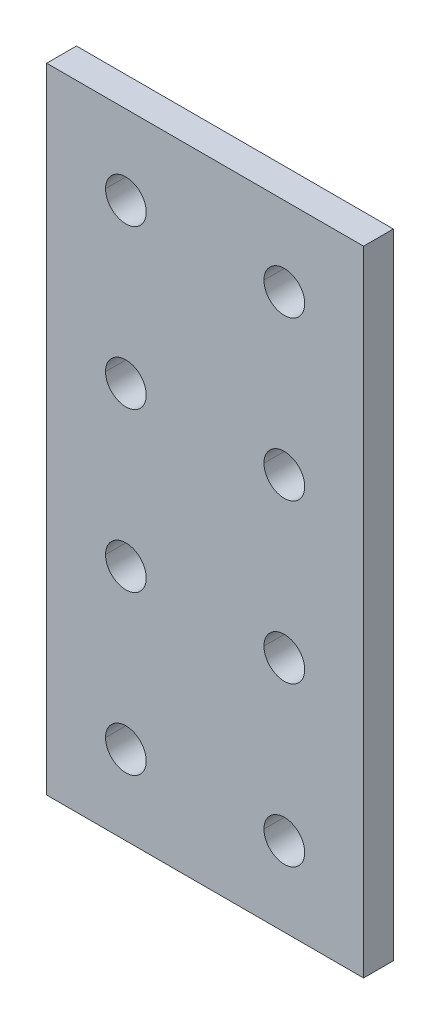
ISO-10303-21;
HEADER;
FILE_DESCRIPTION(('STEP AP214'),'2;1');
FILE_NAME('part.step','',(''),(''),'','','');
FILE_SCHEMA(('AUTOMOTIVE_DESIGN { 1 0 10303 214 1 1 1 1 }'));
ENDSEC;
DATA;
#1=APPLICATION_CONTEXT('core data for automotive mechanical design processes');
#2=APPLICATION_PROTOCOL_DEFINITION('international standard','automotive_design',2000,#1);
#3=PRODUCT_CONTEXT('',#1,'mechanical');
#4=PRODUCT('Part','Part','',(#3));
#5=PRODUCT_RELATED_PRODUCT_CATEGORY('part','',(#4));
#6=PRODUCT_DEFINITION_FORMATION('','',#4);
#7=PRODUCT_DEFINITION_CONTEXT('part definition',#1,'design');
#8=PRODUCT_DEFINITION('design','',#6,#7);
#9=PRODUCT_DEFINITION_SHAPE('','',#8);
#10=(LENGTH_UNIT() NAMED_UNIT(*) SI_UNIT(.MILLI.,.METRE.));
#11=(NAMED_UNIT(*) PLANE_ANGLE_UNIT() SI_UNIT($,.RADIAN.));
#12=(NAMED_UNIT(*) SI_UNIT($,.STERADIAN.) SOLID_ANGLE_UNIT());
#13=UNCERTAINTY_MEASURE_WITH_UNIT(LENGTH_MEASURE(1.E-05),#10,'distance_accuracy_value','');
#14=(GEOMETRIC_REPRESENTATION_CONTEXT(3) GLOBAL_UNCERTAINTY_ASSIGNED_CONTEXT((#13)) GLOBAL_UNIT_ASSIGNED_CONTEXT((#10,
#11,#12)) REPRESENTATION_CONTEXT('',''));
#15=CARTESIAN_POINT('',(0.,0.,0.));
#16=DIRECTION('',(0.,0.,1.));
#17=DIRECTION('',(1.,0.,0.));
#18=AXIS2_PLACEMENT_3D('',#15,#16,#17);
#19=CARTESIAN_POINT('',(25.4,50.8,2.3876));
#20=DIRECTION('',(0.,-1.,0.));
#21=DIRECTION('',(0.,0.,-1.));
#22=AXIS2_PLACEMENT_3D('',#19,#20,#21);
#23=PLANE('',#22);
#24=DIRECTION('',(-1.,0.,0.));
#25=VECTOR('',#24,1.);
#26=CARTESIAN_POINT('',(25.4,50.8,-2.3876));
#27=LINE('',#26,#25);
#28=CARTESIAN_POINT('',(25.4,50.8,-2.3876));
#29=VERTEX_POINT('',#28);
#30=CARTESIAN_POINT('',(-25.4,50.8,-2.3876));
#31=VERTEX_POINT('',#30);
#32=EDGE_CURVE('E9',#29,#31,#27,.T.);
#33=ORIENTED_EDGE('',*,*,#32,.T.);
#34=DIRECTION('',(0.,0.,-1.));
#35=VECTOR('',#34,1.);
#36=CARTESIAN_POINT('',(-25.4,50.8,2.3876));
#37=LINE('',#36,#35);
#38=CARTESIAN_POINT('',(-25.4,50.8,2.3876));
#39=VERTEX_POINT('',#38);
#40=EDGE_CURVE('E24',#39,#31,#37,.T.);
#41=ORIENTED_EDGE('',*,*,#40,.F.);
#42=DIRECTION('',(-1.,0.,0.));
#43=VECTOR('',#42,1.);
#44=CARTESIAN_POINT('',(25.4,50.8,2.3876));
#45=LINE('',#44,#43);
#46=CARTESIAN_POINT('',(25.4,50.8,2.3876));
#47=VERTEX_POINT('',#46);
#48=EDGE_CURVE('E451',#47,#39,#45,.T.);
#49=ORIENTED_EDGE('',*,*,#48,.F.);
#50=DIRECTION('',(0.,0.,-1.));
#51=VECTOR('',#50,1.);
#52=CARTESIAN_POINT('',(25.4,50.8,2.3876));
#53=LINE('',#52,#51);
#54=EDGE_CURVE('E446',#47,#29,#53,.T.);
#55=ORIENTED_EDGE('',*,*,#54,.T.);
#56=EDGE_LOOP('',(#33,#41,#49,#55));
#57=FACE_BOUND('',#56,.T.);
#58=ADVANCED_FACE('F15',(#57),#23,.F.);
#59=CARTESIAN_POINT('',(25.4,-50.8,2.3876));
#60=DIRECTION('',(-1.,0.,0.));
#61=DIRECTION('',(0.,0.,1.));
#62=AXIS2_PLACEMENT_3D('',#59,#60,#61);
#63=PLANE('',#62);
#64=DIRECTION('',(0.,1.,0.));
#65=VECTOR('',#64,1.);
#66=CARTESIAN_POINT('',(25.4,-50.8,-2.3876));
#67=LINE('',#66,#65);
#68=CARTESIAN_POINT('',(25.4,-50.8,-2.3876));
#69=VERTEX_POINT('',#68);
#70=EDGE_CURVE('E440',#69,#29,#67,.T.);
#71=ORIENTED_EDGE('',*,*,#70,.T.);
#72=ORIENTED_EDGE('',*,*,#54,.F.);
#73=DIRECTION('',(0.,1.,0.));
#74=VECTOR('',#73,1.);
#75=CARTESIAN_POINT('',(25.4,-50.8,2.3876));
#76=LINE('',#75,#74);
#77=CARTESIAN_POINT('',(25.4,-50.8,2.3876));
#78=VERTEX_POINT('',#77);
#79=EDGE_CURVE('E434',#78,#47,#76,.T.);
#80=ORIENTED_EDGE('',*,*,#79,.F.);
#81=DIRECTION('',(0.,0.,-1.));
#82=VECTOR('',#81,1.);
#83=CARTESIAN_POINT('',(25.4,-50.8,2.3876));
#84=LINE('',#83,#82);
#85=EDGE_CURVE('E429',#78,#69,#84,.T.);
#86=ORIENTED_EDGE('',*,*,#85,.T.);
#87=EDGE_LOOP('',(#71,#72,#80,#86));
#88=FACE_BOUND('',#87,.T.);
#89=ADVANCED_FACE('F477',(#88),#63,.F.);
#90=CARTESIAN_POINT('',(-25.4,-50.8,2.3876));
#91=DIRECTION('',(0.,1.,0.));
#92=DIRECTION('',(0.,0.,1.));
#93=AXIS2_PLACEMENT_3D('',#90,#91,#92);
#94=PLANE('',#93);
#95=DIRECTION('',(1.,0.,0.));
#96=VECTOR('',#95,1.);
#97=CARTESIAN_POINT('',(-25.4,-50.8,-2.3876));
#98=LINE('',#97,#96);
#99=CARTESIAN_POINT('',(-25.4,-50.8,-2.3876));
#100=VERTEX_POINT('',#99);
#101=EDGE_CURVE('E423',#100,#69,#98,.T.);
#102=ORIENTED_EDGE('',*,*,#101,.T.);
#103=ORIENTED_EDGE('',*,*,#85,.F.);
#104=DIRECTION('',(1.,0.,0.));
#105=VECTOR('',#104,1.);
#106=CARTESIAN_POINT('',(-25.4,-50.8,2.3876));
#107=LINE('',#106,#105);
#108=CARTESIAN_POINT('',(-25.4,-50.8,2.3876));
#109=VERTEX_POINT('',#108);
#110=EDGE_CURVE('E417',#109,#78,#107,.T.);
#111=ORIENTED_EDGE('',*,*,#110,.F.);
#112=DIRECTION('',(0.,0.,-1.));
#113=VECTOR('',#112,1.);
#114=CARTESIAN_POINT('',(-25.4,-50.8,2.3876));
#115=LINE('',#114,#113);
#116=EDGE_CURVE('E412',#109,#100,#115,.T.);
#117=ORIENTED_EDGE('',*,*,#116,.T.);
#118=EDGE_LOOP('',(#102,#103,#111,#117));
#119=FACE_BOUND('',#118,.T.);
#120=ADVANCED_FACE('F472',(#119),#94,.F.);
#121=CARTESIAN_POINT('',(-25.4,50.8,2.3876));
#122=DIRECTION('',(1.,0.,0.));
#123=DIRECTION('',(0.,0.,-1.));
#124=AXIS2_PLACEMENT_3D('',#121,#122,#123);
#125=PLANE('',#124);
#126=DIRECTION('',(0.,-1.,0.));
#127=VECTOR('',#126,1.);
#128=CARTESIAN_POINT('',(-25.4,50.8,-2.3876));
#129=LINE('',#128,#127);
#130=EDGE_CURVE('E406',#31,#100,#129,.T.);
#131=ORIENTED_EDGE('',*,*,#130,.T.);
#132=ORIENTED_EDGE('',*,*,#116,.F.);
#133=DIRECTION('',(0.,-1.,0.));
#134=VECTOR('',#133,1.);
#135=CARTESIAN_POINT('',(-25.4,50.8,2.3876));
#136=LINE('',#135,#134);
#137=EDGE_CURVE('E400',#39,#109,#136,.T.);
#138=ORIENTED_EDGE('',*,*,#137,.F.);
#139=ORIENTED_EDGE('',*,*,#40,.T.);
#140=EDGE_LOOP('',(#131,#132,#138,#139));
#141=FACE_BOUND('',#140,.T.);
#142=ADVANCED_FACE('F465',(#141),#125,.F.);
#143=CARTESIAN_POINT('',(0.,-50.8,2.3876));
#144=DIRECTION('',(0.,0.,1.));
#145=DIRECTION('',(1.,0.,0.));
#146=AXIS2_PLACEMENT_3D('',#143,#144,#145);
#147=PLANE('',#146);
#148=CARTESIAN_POINT('',(-12.7,38.1,2.3876));
#149=DIRECTION('',(0.,0.,1.));
#150=DIRECTION('',(1.,0.,0.));
#151=AXIS2_PLACEMENT_3D('',#148,#149,#150);
#152=CIRCLE('',#151,3.2639);
#153=CARTESIAN_POINT('',(-9.4361,38.1,2.3876));
#154=VERTEX_POINT('',#153);
#155=CARTESIAN_POINT('',(-15.9639,38.1,2.3876));
#156=VERTEX_POINT('',#155);
#157=EDGE_CURVE('E394',#154,#156,#152,.T.);
#158=ORIENTED_EDGE('',*,*,#157,.F.);
#159=CARTESIAN_POINT('',(-12.7,38.1,2.3876));
#160=DIRECTION('',(0.,0.,1.));
#161=DIRECTION('',(1.,0.,0.));
#162=AXIS2_PLACEMENT_3D('',#159,#160,#161);
#163=CIRCLE('',#162,3.2639);
#164=EDGE_CURVE('E388',#156,#154,#163,.T.);
#165=ORIENTED_EDGE('',*,*,#164,.F.);
#166=EDGE_LOOP('',(#158,#165));
#167=FACE_BOUND('',#166,.T.);
#168=CARTESIAN_POINT('',(-12.7,12.7,2.3876));
#169=DIRECTION('',(0.,0.,1.));
#170=DIRECTION('',(1.,0.,0.));
#171=AXIS2_PLACEMENT_3D('',#168,#169,#170);
#172=CIRCLE('',#171,3.2639);
#173=CARTESIAN_POINT('',(-9.4361,12.7,2.3876));
#174=VERTEX_POINT('',#173);
#175=CARTESIAN_POINT('',(-15.9639,12.7,2.3876));
#176=VERTEX_POINT('',#175);
#177=EDGE_CURVE('E382',#174,#176,#172,.T.);
#178=ORIENTED_EDGE('',*,*,#177,.F.);
#179=CARTESIAN_POINT('',(-12.7,12.7,2.3876));
#180=DIRECTION('',(0.,0.,1.));
#181=DIRECTION('',(1.,0.,0.));
#182=AXIS2_PLACEMENT_3D('',#179,#180,#181);
#183=CIRCLE('',#182,3.2639);
#184=EDGE_CURVE('E376',#176,#174,#183,.T.);
#185=ORIENTED_EDGE('',*,*,#184,.F.);
#186=EDGE_LOOP('',(#178,#185));
#187=FACE_BOUND('',#186,.T.);
#188=CARTESIAN_POINT('',(-12.7,-12.7,2.3876));
#189=DIRECTION('',(0.,0.,1.));
#190=DIRECTION('',(1.,0.,0.));
#191=AXIS2_PLACEMENT_3D('',#188,#189,#190);
#192=CIRCLE('',#191,3.2639);
#193=CARTESIAN_POINT('',(-9.4361,-12.7,2.3876));
#194=VERTEX_POINT('',#193);
#195=CARTESIAN_POINT('',(-15.9639,-12.7,2.3876));
#196=VERTEX_POINT('',#195);
#197=EDGE_CURVE('E370',#194,#196,#192,.T.);
#198=ORIENTED_EDGE('',*,*,#197,.F.);
#199=CARTESIAN_POINT('',(-12.7,-12.7,2.3876));
#200=DIRECTION('',(0.,0.,1.));
#201=DIRECTION('',(1.,0.,0.));
#202=AXIS2_PLACEMENT_3D('',#199,#200,#201);
#203=CIRCLE('',#202,3.2639);
#204=EDGE_CURVE('E364',#196,#194,#203,.T.);
#205=ORIENTED_EDGE('',*,*,#204,.F.);
#206=EDGE_LOOP('',(#198,#205));
#207=FACE_BOUND('',#206,.T.);
#208=CARTESIAN_POINT('',(-12.7,-38.1,2.3876));
#209=DIRECTION('',(0.,0.,1.));
#210=DIRECTION('',(1.,0.,0.));
#211=AXIS2_PLACEMENT_3D('',#208,#209,#210);
#212=CIRCLE('',#211,3.2639);
#213=CARTESIAN_POINT('',(-9.4361,-38.1,2.3876));
#214=VERTEX_POINT('',#213);
#215=CARTESIAN_POINT('',(-15.9639,-38.1,2.3876));
#216=VERTEX_POINT('',#215);
#217=EDGE_CURVE('E358',#214,#216,#212,.T.);
#218=ORIENTED_EDGE('',*,*,#217,.F.);
#219=CARTESIAN_POINT('',(-12.7,-38.1,2.3876));
#220=DIRECTION('',(0.,0.,1.));
#221=DIRECTION('',(1.,0.,0.));
#222=AXIS2_PLACEMENT_3D('',#219,#220,#221);
#223=CIRCLE('',#222,3.2639);
#224=EDGE_CURVE('E352',#216,#214,#223,.T.);
#225=ORIENTED_EDGE('',*,*,#224,.F.);
#226=EDGE_LOOP('',(#218,#225));
#227=FACE_BOUND('',#226,.T.);
#228=CARTESIAN_POINT('',(12.7,38.1,2.3876));
#229=DIRECTION('',(0.,0.,1.));
#230=DIRECTION('',(1.,0.,0.));
#231=AXIS2_PLACEMENT_3D('',#228,#229,#230);
#232=CIRCLE('',#231,3.2639);
#233=CARTESIAN_POINT('',(15.9639,38.1,2.3876));
#234=VERTEX_POINT('',#233);
#235=CARTESIAN_POINT('',(9.4361,38.1,2.3876));
#236=VERTEX_POINT('',#235);
#237=EDGE_CURVE('E346',#234,#236,#232,.T.);
#238=ORIENTED_EDGE('',*,*,#237,.F.);
#239=CARTESIAN_POINT('',(12.7,38.1,2.3876));
#240=DIRECTION('',(0.,0.,1.));
#241=DIRECTION('',(1.,0.,0.));
#242=AXIS2_PLACEMENT_3D('',#239,#240,#241);
#243=CIRCLE('',#242,3.2639);
#244=EDGE_CURVE('E340',#236,#234,#243,.T.);
#245=ORIENTED_EDGE('',*,*,#244,.F.);
#246=EDGE_LOOP('',(#238,#245));
#247=FACE_BOUND('',#246,.T.);
#248=CARTESIAN_POINT('',(12.7,12.7,2.3876));
#249=DIRECTION('',(0.,0.,1.));
#250=DIRECTION('',(1.,0.,0.));
#251=AXIS2_PLACEMENT_3D('',#248,#249,#250);
#252=CIRCLE('',#251,3.2639);
#253=CARTESIAN_POINT('',(15.9639,12.7,2.3876));
#254=VERTEX_POINT('',#253);
#255=CARTESIAN_POINT('',(9.4361,12.7,2.3876));
#256=VERTEX_POINT('',#255);
#257=EDGE_CURVE('E334',#254,#256,#252,.T.);
#258=ORIENTED_EDGE('',*,*,#257,.F.);
#259=CARTESIAN_POINT('',(12.7,12.7,2.3876));
#260=DIRECTION('',(0.,0.,1.));
#261=DIRECTION('',(1.,0.,0.));
#262=AXIS2_PLACEMENT_3D('',#259,#260,#261);
#263=CIRCLE('',#262,3.2639);
#264=EDGE_CURVE('E328',#256,#254,#263,.T.);
#265=ORIENTED_EDGE('',*,*,#264,.F.);
#266=EDGE_LOOP('',(#258,#265));
#267=FACE_BOUND('',#266,.T.);
#268=CARTESIAN_POINT('',(12.7,-12.7,2.3876));
#269=DIRECTION('',(0.,0.,1.));
#270=DIRECTION('',(1.,0.,0.));
#271=AXIS2_PLACEMENT_3D('',#268,#269,#270);
#272=CIRCLE('',#271,3.2639);
#273=CARTESIAN_POINT('',(15.9639,-12.7,2.3876));
#274=VERTEX_POINT('',#273);
#275=CARTESIAN_POINT('',(9.4361,-12.7,2.3876));
#276=VERTEX_POINT('',#275);
#277=EDGE_CURVE('E323',#274,#276,#272,.T.);
#278=ORIENTED_EDGE('',*,*,#277,.F.);
#279=CARTESIAN_POINT('',(12.7,-12.7,2.3876));
#280=DIRECTION('',(0.,0.,1.));
#281=DIRECTION('',(1.,0.,0.));
#282=AXIS2_PLACEMENT_3D('',#279,#280,#281);
#283=CIRCLE('',#282,3.2639);
#284=EDGE_CURVE('E164',#276,#274,#283,.T.);
#285=ORIENTED_EDGE('',*,*,#284,.F.);
#286=EDGE_LOOP('',(#278,#285));
#287=FACE_BOUND('',#286,.T.);
#288=CARTESIAN_POINT('',(12.7,-38.1,2.3876));
#289=DIRECTION('',(0.,0.,1.));
#290=DIRECTION('',(1.,0.,0.));
#291=AXIS2_PLACEMENT_3D('',#288,#289,#290);
#292=CIRCLE('',#291,3.2639);
#293=CARTESIAN_POINT('',(15.9639,-38.1,2.3876));
#294=VERTEX_POINT('',#293);
#295=CARTESIAN_POINT('',(9.4361,-38.1,2.3876));
#296=VERTEX_POINT('',#295);
#297=EDGE_CURVE('E314',#294,#296,#292,.T.);
#298=ORIENTED_EDGE('',*,*,#297,.F.);
#299=CARTESIAN_POINT('',(12.7,-38.1,2.3876));
#300=DIRECTION('',(0.,0.,1.));
#301=DIRECTION('',(1.,0.,0.));
#302=AXIS2_PLACEMENT_3D('',#299,#300,#301);
#303=CIRCLE('',#302,3.2639);
#304=EDGE_CURVE('E309',#296,#294,#303,.T.);
#305=ORIENTED_EDGE('',*,*,#304,.F.);
#306=EDGE_LOOP('',(#298,#305));
#307=FACE_BOUND('',#306,.T.);
#308=ORIENTED_EDGE('',*,*,#48,.T.);
#309=ORIENTED_EDGE('',*,*,#137,.T.);
#310=ORIENTED_EDGE('',*,*,#110,.T.);
#311=ORIENTED_EDGE('',*,*,#79,.T.);
#312=EDGE_LOOP('',(#308,#309,#310,#311));
#313=FACE_BOUND('',#312,.T.);
#314=ADVANCED_FACE('F474',(#167,#187,#207,#227,#247,#267,#287,#307,#313),#147,.T.);
#315=CARTESIAN_POINT('',(12.7,-38.1,2.3876));
#316=DIRECTION('',(0.,0.,1.));
#317=DIRECTION('',(0.,1.,0.));
#318=AXIS2_PLACEMENT_3D('',#315,#316,#317);
#319=CYLINDRICAL_SURFACE('',#318,3.2639);
#320=CARTESIAN_POINT('',(12.7,-38.1,-2.3876));
#321=DIRECTION('',(0.,0.,1.));
#322=DIRECTION('',(1.,0.,0.));
#323=AXIS2_PLACEMENT_3D('',#320,#321,#322);
#324=CIRCLE('',#323,3.2639);
#325=CARTESIAN_POINT('',(9.4361,-38.1,-2.3876));
#326=VERTEX_POINT('',#325);
#327=CARTESIAN_POINT('',(15.9639,-38.1,-2.3876));
#328=VERTEX_POINT('',#327);
#329=EDGE_CURVE('E305',#326,#328,#324,.T.);
#330=ORIENTED_EDGE('',*,*,#329,.F.);
#331=CARTESIAN_POINT('',(9.4361,-38.1,-2.3876));
#332=DIRECTION('',(0.,0.,1.));
#333=VECTOR('',#332,1.);
#334=LINE('',#331,#333);
#335=EDGE_CURVE('E282',#326,#296,#334,.T.);
#336=ORIENTED_EDGE('',*,*,#335,.T.);
#337=ORIENTED_EDGE('',*,*,#304,.T.);
#338=CARTESIAN_POINT('',(15.9639,-38.1,-2.3876));
#339=DIRECTION('',(0.,0.,1.));
#340=VECTOR('',#339,1.);
#341=LINE('',#338,#340);
#342=EDGE_CURVE('E295',#328,#294,#341,.T.);
#343=ORIENTED_EDGE('',*,*,#342,.F.);
#344=EDGE_LOOP('',(#330,#336,#337,#343));
#345=FACE_BOUND('',#344,.T.);
#346=ADVANCED_FACE('F260',(#345),#319,.F.);
#347=CARTESIAN_POINT('',(12.7,-38.1,2.3876));
#348=DIRECTION('',(0.,0.,1.));
#349=DIRECTION('',(0.,-1.,0.));
#350=AXIS2_PLACEMENT_3D('',#347,#348,#349);
#351=CYLINDRICAL_SURFACE('',#350,3.2639);
#352=ORIENTED_EDGE('',*,*,#297,.T.);
#353=ORIENTED_EDGE('',*,*,#335,.F.);
#354=CARTESIAN_POINT('',(12.7,-38.1,-2.3876));
#355=DIRECTION('',(0.,0.,1.));
#356=DIRECTION('',(1.,0.,0.));
#357=AXIS2_PLACEMENT_3D('',#354,#355,#356);
#358=CIRCLE('',#357,3.2639);
#359=EDGE_CURVE('E241',#328,#326,#358,.T.);
#360=ORIENTED_EDGE('',*,*,#359,.F.);
#361=ORIENTED_EDGE('',*,*,#342,.T.);
#362=EDGE_LOOP('',(#352,#353,#360,#361));
#363=FACE_BOUND('',#362,.T.);
#364=ADVANCED_FACE('F250',(#363),#351,.F.);
#365=CARTESIAN_POINT('',(0.,-50.8,-2.3876));
#366=DIRECTION('',(0.,0.,1.));
#367=DIRECTION('',(1.,0.,0.));
#368=AXIS2_PLACEMENT_3D('',#365,#366,#367);
#369=PLANE('',#368);
#370=CARTESIAN_POINT('',(-12.7,38.1,-2.3876));
#371=DIRECTION('',(0.,0.,1.));
#372=DIRECTION('',(1.,0.,0.));
#373=AXIS2_PLACEMENT_3D('',#370,#371,#372);
#374=CIRCLE('',#373,3.2639);
#375=CARTESIAN_POINT('',(-9.4361,38.1,-2.3876));
#376=VERTEX_POINT('',#375);
#377=CARTESIAN_POINT('',(-15.9639,38.1,-2.3876));
#378=VERTEX_POINT('',#377);
#379=EDGE_CURVE('E236',#376,#378,#374,.T.);
#380=ORIENTED_EDGE('',*,*,#379,.T.);
#381=CARTESIAN_POINT('',(-12.7,38.1,-2.3876));
#382=DIRECTION('',(0.,0.,1.));
#383=DIRECTION('',(1.,0.,0.));
#384=AXIS2_PLACEMENT_3D('',#381,#382,#383);
#385=CIRCLE('',#384,3.2639);
#386=EDGE_CURVE('E231',#378,#376,#385,.T.);
#387=ORIENTED_EDGE('',*,*,#386,.T.);
#388=EDGE_LOOP('',(#380,#387));
#389=FACE_BOUND('',#388,.T.);
#390=CARTESIAN_POINT('',(-12.7,12.7,-2.3876));
#391=DIRECTION('',(0.,0.,1.));
#392=DIRECTION('',(1.,0.,0.));
#393=AXIS2_PLACEMENT_3D('',#390,#391,#392);
#394=CIRCLE('',#393,3.2639);
#395=CARTESIAN_POINT('',(-9.4361,12.7,-2.3876));
#396=VERTEX_POINT('',#395);
#397=CARTESIAN_POINT('',(-15.9639,12.7,-2.3876));
#398=VERTEX_POINT('',#397);
#399=EDGE_CURVE('E226',#396,#398,#394,.T.);
#400=ORIENTED_EDGE('',*,*,#399,.T.);
#401=CARTESIAN_POINT('',(-12.7,12.7,-2.3876));
#402=DIRECTION('',(0.,0.,1.));
#403=DIRECTION('',(1.,0.,0.));
#404=AXIS2_PLACEMENT_3D('',#401,#402,#403);
#405=CIRCLE('',#404,3.2639);
#406=EDGE_CURVE('E221',#398,#396,#405,.T.);
#407=ORIENTED_EDGE('',*,*,#406,.T.);
#408=EDGE_LOOP('',(#400,#407));
#409=FACE_BOUND('',#408,.T.);
#410=CARTESIAN_POINT('',(-12.7,-12.7,-2.3876));
#411=DIRECTION('',(0.,0.,1.));
#412=DIRECTION('',(1.,0.,0.));
#413=AXIS2_PLACEMENT_3D('',#410,#411,#412);
#414=CIRCLE('',#413,3.2639);
#415=CARTESIAN_POINT('',(-9.4361,-12.7,-2.3876));
#416=VERTEX_POINT('',#415);
#417=CARTESIAN_POINT('',(-15.9639,-12.7,-2.3876));
#418=VERTEX_POINT('',#417);
#419=EDGE_CURVE('E216',#416,#418,#414,.T.);
#420=ORIENTED_EDGE('',*,*,#419,.T.);
#421=CARTESIAN_POINT('',(-12.7,-12.7,-2.3876));
#422=DIRECTION('',(0.,0.,1.));
#423=DIRECTION('',(1.,0.,0.));
#424=AXIS2_PLACEMENT_3D('',#421,#422,#423);
#425=CIRCLE('',#424,3.2639);
#426=EDGE_CURVE('E211',#418,#416,#425,.T.);
#427=ORIENTED_EDGE('',*,*,#426,.T.);
#428=EDGE_LOOP('',(#420,#427));
#429=FACE_BOUND('',#428,.T.);
#430=CARTESIAN_POINT('',(-12.7,-38.1,-2.3876));
#431=DIRECTION('',(0.,0.,1.));
#432=DIRECTION('',(1.,0.,0.));
#433=AXIS2_PLACEMENT_3D('',#430,#431,#432);
#434=CIRCLE('',#433,3.2639);
#435=CARTESIAN_POINT('',(-9.4361,-38.1,-2.3876));
#436=VERTEX_POINT('',#435);
#437=CARTESIAN_POINT('',(-15.9639,-38.1,-2.3876));
#438=VERTEX_POINT('',#437);
#439=EDGE_CURVE('E206',#436,#438,#434,.T.);
#440=ORIENTED_EDGE('',*,*,#439,.T.);
#441=CARTESIAN_POINT('',(-12.7,-38.1,-2.3876));
#442=DIRECTION('',(0.,0.,1.));
#443=DIRECTION('',(1.,0.,0.));
#444=AXIS2_PLACEMENT_3D('',#441,#442,#443);
#445=CIRCLE('',#444,3.2639);
#446=EDGE_CURVE('E201',#438,#436,#445,.T.);
#447=ORIENTED_EDGE('',*,*,#446,.T.);
#448=EDGE_LOOP('',(#440,#447));
#449=FACE_BOUND('',#448,.T.);
#450=CARTESIAN_POINT('',(12.7,38.1,-2.3876));
#451=DIRECTION('',(0.,0.,1.));
#452=DIRECTION('',(1.,0.,0.));
#453=AXIS2_PLACEMENT_3D('',#450,#451,#452);
#454=CIRCLE('',#453,3.2639);
#455=CARTESIAN_POINT('',(15.9639,38.1,-2.3876));
#456=VERTEX_POINT('',#455);
#457=CARTESIAN_POINT('',(9.4361,38.1,-2.3876));
#458=VERTEX_POINT('',#457);
#459=EDGE_CURVE('E196',#456,#458,#454,.T.);
#460=ORIENTED_EDGE('',*,*,#459,.T.);
#461=CARTESIAN_POINT('',(12.7,38.1,-2.3876));
#462=DIRECTION('',(0.,0.,1.));
#463=DIRECTION('',(1.,0.,0.));
#464=AXIS2_PLACEMENT_3D('',#461,#462,#463);
#465=CIRCLE('',#464,3.2639);
#466=EDGE_CURVE('E191',#458,#456,#465,.T.);
#467=ORIENTED_EDGE('',*,*,#466,.T.);
#468=EDGE_LOOP('',(#460,#467));
#469=FACE_BOUND('',#468,.T.);
#470=CARTESIAN_POINT('',(12.7,12.7,-2.3876));
#471=DIRECTION('',(0.,0.,1.));
#472=DIRECTION('',(1.,0.,0.));
#473=AXIS2_PLACEMENT_3D('',#470,#471,#472);
#474=CIRCLE('',#473,3.2639);
#475=CARTESIAN_POINT('',(15.9639,12.7,-2.3876));
#476=VERTEX_POINT('',#475);
#477=CARTESIAN_POINT('',(9.4361,12.7,-2.3876));
#478=VERTEX_POINT('',#477);
#479=EDGE_CURVE('E180',#476,#478,#474,.T.);
#480=ORIENTED_EDGE('',*,*,#479,.T.);
#481=CARTESIAN_POINT('',(12.7,12.7,-2.3876));
#482=DIRECTION('',(0.,0.,1.));
#483=DIRECTION('',(1.,0.,0.));
#484=AXIS2_PLACEMENT_3D('',#481,#482,#483);
#485=CIRCLE('',#484,3.2639);
#486=EDGE_CURVE('E175',#478,#476,#485,.T.);
#487=ORIENTED_EDGE('',*,*,#486,.T.);
#488=EDGE_LOOP('',(#480,#487));
#489=FACE_BOUND('',#488,.T.);
#490=CARTESIAN_POINT('',(12.7,-12.7,-2.3876));
#491=DIRECTION('',(0.,0.,1.));
#492=DIRECTION('',(1.,0.,0.));
#493=AXIS2_PLACEMENT_3D('',#490,#491,#492);
#494=CIRCLE('',#493,3.2639);
#495=CARTESIAN_POINT('',(15.9639,-12.7,-2.3876));
#496=VERTEX_POINT('',#495);
#497=CARTESIAN_POINT('',(9.4361,-12.7,-2.3876));
#498=VERTEX_POINT('',#497);
#499=EDGE_CURVE('E152',#496,#498,#494,.T.);
#500=ORIENTED_EDGE('',*,*,#499,.T.);
#501=CARTESIAN_POINT('',(12.7,-12.7,-2.3876));
#502=DIRECTION('',(0.,0.,1.));
#503=DIRECTION('',(1.,0.,0.));
#504=AXIS2_PLACEMENT_3D('',#501,#502,#503);
#505=CIRCLE('',#504,3.2639);
#506=EDGE_CURVE('E147',#498,#496,#505,.T.);
#507=ORIENTED_EDGE('',*,*,#506,.T.);
#508=EDGE_LOOP('',(#500,#507));
#509=FACE_BOUND('',#508,.T.);
#510=ORIENTED_EDGE('',*,*,#359,.T.);
#511=ORIENTED_EDGE('',*,*,#329,.T.);
#512=EDGE_LOOP('',(#510,#511));
#513=FACE_BOUND('',#512,.T.);
#514=ORIENTED_EDGE('',*,*,#32,.F.);
#515=ORIENTED_EDGE('',*,*,#70,.F.);
#516=ORIENTED_EDGE('',*,*,#101,.F.);
#517=ORIENTED_EDGE('',*,*,#130,.F.);
#518=EDGE_LOOP('',(#514,#515,#516,#517));
#519=FACE_BOUND('',#518,.T.);
#520=ADVANCED_FACE('F149',(#389,#409,#429,#449,#469,#489,#509,#513,#519),#369,.F.);
#521=CARTESIAN_POINT('',(12.7,-12.7,2.3876));
#522=DIRECTION('',(0.,0.,1.));
#523=DIRECTION('',(0.,1.,0.));
#524=AXIS2_PLACEMENT_3D('',#521,#522,#523);
#525=CYLINDRICAL_SURFACE('',#524,3.2639);
#526=ORIENTED_EDGE('',*,*,#506,.F.);
#527=CARTESIAN_POINT('',(9.4361,-12.7,-2.3876));
#528=DIRECTION('',(0.,0.,1.));
#529=VECTOR('',#528,1.);
#530=LINE('',#527,#529);
#531=EDGE_CURVE('E157',#498,#276,#530,.T.);
#532=ORIENTED_EDGE('',*,*,#531,.T.);
#533=ORIENTED_EDGE('',*,*,#284,.T.);
#534=CARTESIAN_POINT('',(15.9639,-12.7,-2.3876));
#535=DIRECTION('',(0.,0.,1.));
#536=VECTOR('',#535,1.);
#537=LINE('',#534,#536);
#538=EDGE_CURVE('E161',#496,#274,#537,.T.);
#539=ORIENTED_EDGE('',*,*,#538,.F.);
#540=EDGE_LOOP('',(#526,#532,#533,#539));
#541=FACE_BOUND('',#540,.T.);
#542=ADVANCED_FACE('F163',(#541),#525,.F.);
#543=CARTESIAN_POINT('',(12.7,-12.7,2.3876));
#544=DIRECTION('',(0.,0.,1.));
#545=DIRECTION('',(0.,-1.,0.));
#546=AXIS2_PLACEMENT_3D('',#543,#544,#545);
#547=CYLINDRICAL_SURFACE('',#546,3.2639);
#548=ORIENTED_EDGE('',*,*,#277,.T.);
#549=ORIENTED_EDGE('',*,*,#531,.F.);
#550=ORIENTED_EDGE('',*,*,#499,.F.);
#551=ORIENTED_EDGE('',*,*,#538,.T.);
#552=EDGE_LOOP('',(#548,#549,#550,#551));
#553=FACE_BOUND('',#552,.T.);
#554=ADVANCED_FACE('F172',(#553),#547,.F.);
#555=CARTESIAN_POINT('',(12.7,12.7,2.3876));
#556=DIRECTION('',(0.,0.,1.));
#557=DIRECTION('',(0.,1.,0.));
#558=AXIS2_PLACEMENT_3D('',#555,#556,#557);
#559=CYLINDRICAL_SURFACE('',#558,3.2639);
#560=ORIENTED_EDGE('',*,*,#486,.F.);
#561=CARTESIAN_POINT('',(9.4361,12.7,-2.3876));
#562=DIRECTION('',(0.,0.,1.));
#563=VECTOR('',#562,1.);
#564=LINE('',#561,#563);
#565=EDGE_CURVE('E169',#478,#256,#564,.T.);
#566=ORIENTED_EDGE('',*,*,#565,.T.);
#567=ORIENTED_EDGE('',*,*,#264,.T.);
#568=CARTESIAN_POINT('',(15.9639,12.7,-2.3876));
#569=DIRECTION('',(0.,0.,1.));
#570=VECTOR('',#569,1.);
#571=LINE('',#568,#570);
#572=EDGE_CURVE('E534',#476,#254,#571,.T.);
#573=ORIENTED_EDGE('',*,*,#572,.F.);
#574=EDGE_LOOP('',(#560,#566,#567,#573));
#575=FACE_BOUND('',#574,.T.);
#576=ADVANCED_FACE('F532',(#575),#559,.F.);
#577=CARTESIAN_POINT('',(12.7,12.7,2.3876));
#578=DIRECTION('',(0.,0.,1.));
#579=DIRECTION('',(0.,-1.,0.));
#580=AXIS2_PLACEMENT_3D('',#577,#578,#579);
#581=CYLINDRICAL_SURFACE('',#580,3.2639);
#582=ORIENTED_EDGE('',*,*,#257,.T.);
#583=ORIENTED_EDGE('',*,*,#565,.F.);
#584=ORIENTED_EDGE('',*,*,#479,.F.);
#585=ORIENTED_EDGE('',*,*,#572,.T.);
#586=EDGE_LOOP('',(#582,#583,#584,#585));
#587=FACE_BOUND('',#586,.T.);
#588=ADVANCED_FACE('F537',(#587),#581,.F.);
#589=CARTESIAN_POINT('',(12.7,38.1,2.3876));
#590=DIRECTION('',(0.,0.,1.));
#591=DIRECTION('',(0.,1.,0.));
#592=AXIS2_PLACEMENT_3D('',#589,#590,#591);
#593=CYLINDRICAL_SURFACE('',#592,3.2639);
#594=ORIENTED_EDGE('',*,*,#466,.F.);
#595=CARTESIAN_POINT('',(9.4361,38.1,-2.3876));
#596=DIRECTION('',(0.,0.,1.));
#597=VECTOR('',#596,1.);
#598=LINE('',#595,#597);
#599=EDGE_CURVE('E610',#458,#236,#598,.T.);
#600=ORIENTED_EDGE('',*,*,#599,.T.);
#601=ORIENTED_EDGE('',*,*,#244,.T.);
#602=CARTESIAN_POINT('',(15.9639,38.1,-2.3876));
#603=DIRECTION('',(0.,0.,1.));
#604=VECTOR('',#603,1.);
#605=LINE('',#602,#604);
#606=EDGE_CURVE('E614',#456,#234,#605,.T.);
#607=ORIENTED_EDGE('',*,*,#606,.F.);
#608=EDGE_LOOP('',(#594,#600,#601,#607));
#609=FACE_BOUND('',#608,.T.);
#610=ADVANCED_FACE('F867',(#609),#593,.F.);
#611=CARTESIAN_POINT('',(12.7,38.1,2.3876));
#612=DIRECTION('',(0.,0.,1.));
#613=DIRECTION('',(0.,-1.,0.));
#614=AXIS2_PLACEMENT_3D('',#611,#612,#613);
#615=CYLINDRICAL_SURFACE('',#614,3.2639);
#616=ORIENTED_EDGE('',*,*,#237,.T.);
#617=ORIENTED_EDGE('',*,*,#599,.F.);
#618=ORIENTED_EDGE('',*,*,#459,.F.);
#619=ORIENTED_EDGE('',*,*,#606,.T.);
#620=EDGE_LOOP('',(#616,#617,#618,#619));
#621=FACE_BOUND('',#620,.T.);
#622=ADVANCED_FACE('F829',(#621),#615,.F.);
#623=CARTESIAN_POINT('',(-12.7,-38.1,2.3876));
#624=DIRECTION('',(0.,0.,1.));
#625=DIRECTION('',(0.,1.,0.));
#626=AXIS2_PLACEMENT_3D('',#623,#624,#625);
#627=CYLINDRICAL_SURFACE('',#626,3.2639);
#628=ORIENTED_EDGE('',*,*,#446,.F.);
#629=CARTESIAN_POINT('',(-15.9639,-38.1,-2.3876));
#630=DIRECTION('',(0.,0.,1.));
#631=VECTOR('',#630,1.);
#632=LINE('',#629,#631);
#633=EDGE_CURVE('E618',#438,#216,#632,.T.);
#634=ORIENTED_EDGE('',*,*,#633,.T.);
#635=ORIENTED_EDGE('',*,*,#224,.T.);
#636=CARTESIAN_POINT('',(-9.4361,-38.1,-2.3876));
#637=DIRECTION('',(0.,0.,1.));
#638=VECTOR('',#637,1.);
#639=LINE('',#636,#638);
#640=EDGE_CURVE('E622',#436,#214,#639,.T.);
#641=ORIENTED_EDGE('',*,*,#640,.F.);
#642=EDGE_LOOP('',(#628,#634,#635,#641));
#643=FACE_BOUND('',#642,.T.);
#644=ADVANCED_FACE('F820',(#643),#627,.F.);
#645=CARTESIAN_POINT('',(-12.7,-38.1,2.3876));
#646=DIRECTION('',(0.,0.,1.));
#647=DIRECTION('',(0.,-1.,0.));
#648=AXIS2_PLACEMENT_3D('',#645,#646,#647);
#649=CYLINDRICAL_SURFACE('',#648,3.2639);
#650=ORIENTED_EDGE('',*,*,#217,.T.);
#651=ORIENTED_EDGE('',*,*,#633,.F.);
#652=ORIENTED_EDGE('',*,*,#439,.F.);
#653=ORIENTED_EDGE('',*,*,#640,.T.);
#654=EDGE_LOOP('',(#650,#651,#652,#653));
#655=FACE_BOUND('',#654,.T.);
#656=ADVANCED_FACE('F781',(#655),#649,.F.);
#657=CARTESIAN_POINT('',(-12.7,-12.7,2.3876));
#658=DIRECTION('',(0.,0.,1.));
#659=DIRECTION('',(0.,1.,0.));
#660=AXIS2_PLACEMENT_3D('',#657,#658,#659);
#661=CYLINDRICAL_SURFACE('',#660,3.2639);
#662=ORIENTED_EDGE('',*,*,#426,.F.);
#663=CARTESIAN_POINT('',(-15.9639,-12.7,-2.3876));
#664=DIRECTION('',(0.,0.,1.));
#665=VECTOR('',#664,1.);
#666=LINE('',#663,#665);
#667=EDGE_CURVE('E626',#418,#196,#666,.T.);
#668=ORIENTED_EDGE('',*,*,#667,.T.);
#669=ORIENTED_EDGE('',*,*,#204,.T.);
#670=CARTESIAN_POINT('',(-9.4361,-12.7,-2.3876));
#671=DIRECTION('',(0.,0.,1.));
#672=VECTOR('',#671,1.);
#673=LINE('',#670,#672);
#674=EDGE_CURVE('E630',#416,#194,#673,.T.);
#675=ORIENTED_EDGE('',*,*,#674,.F.);
#676=EDGE_LOOP('',(#662,#668,#669,#675));
#677=FACE_BOUND('',#676,.T.);
#678=ADVANCED_FACE('F772',(#677),#661,.F.);
#679=CARTESIAN_POINT('',(-12.7,-12.7,2.3876));
#680=DIRECTION('',(0.,0.,1.));
#681=DIRECTION('',(0.,-1.,0.));
#682=AXIS2_PLACEMENT_3D('',#679,#680,#681);
#683=CYLINDRICAL_SURFACE('',#682,3.2639);
#684=ORIENTED_EDGE('',*,*,#197,.T.);
#685=ORIENTED_EDGE('',*,*,#667,.F.);
#686=ORIENTED_EDGE('',*,*,#419,.F.);
#687=ORIENTED_EDGE('',*,*,#674,.T.);
#688=EDGE_LOOP('',(#684,#685,#686,#687));
#689=FACE_BOUND('',#688,.T.);
#690=ADVANCED_FACE('F733',(#689),#683,.F.);
#691=CARTESIAN_POINT('',(-12.7,12.7,2.3876));
#692=DIRECTION('',(0.,0.,1.));
#693=DIRECTION('',(0.,1.,0.));
#694=AXIS2_PLACEMENT_3D('',#691,#692,#693);
#695=CYLINDRICAL_SURFACE('',#694,3.2639);
#696=ORIENTED_EDGE('',*,*,#406,.F.);
#697=CARTESIAN_POINT('',(-15.9639,12.7,-2.3876));
#698=DIRECTION('',(0.,0.,1.));
#699=VECTOR('',#698,1.);
#700=LINE('',#697,#699);
#701=EDGE_CURVE('E634',#398,#176,#700,.T.);
#702=ORIENTED_EDGE('',*,*,#701,.T.);
#703=ORIENTED_EDGE('',*,*,#184,.T.);
#704=CARTESIAN_POINT('',(-9.4361,12.7,-2.3876));
#705=DIRECTION('',(0.,0.,1.));
#706=VECTOR('',#705,1.);
#707=LINE('',#704,#706);
#708=EDGE_CURVE('E638',#396,#174,#707,.T.);
#709=ORIENTED_EDGE('',*,*,#708,.F.);
#710=EDGE_LOOP('',(#696,#702,#703,#709));
#711=FACE_BOUND('',#710,.T.);
#712=ADVANCED_FACE('F724',(#711),#695,.F.);
#713=CARTESIAN_POINT('',(-12.7,12.7,2.3876));
#714=DIRECTION('',(0.,0.,1.));
#715=DIRECTION('',(0.,-1.,0.));
#716=AXIS2_PLACEMENT_3D('',#713,#714,#715);
#717=CYLINDRICAL_SURFACE('',#716,3.2639);
#718=ORIENTED_EDGE('',*,*,#177,.T.);
#719=ORIENTED_EDGE('',*,*,#701,.F.);
#720=ORIENTED_EDGE('',*,*,#399,.F.);
#721=ORIENTED_EDGE('',*,*,#708,.T.);
#722=EDGE_LOOP('',(#718,#719,#720,#721));
#723=FACE_BOUND('',#722,.T.);
#724=ADVANCED_FACE('F678',(#723),#717,.F.);
#725=CARTESIAN_POINT('',(-12.7,38.1,2.3876));
#726=DIRECTION('',(0.,0.,1.));
#727=DIRECTION('',(0.,1.,0.));
#728=AXIS2_PLACEMENT_3D('',#725,#726,#727);
#729=CYLINDRICAL_SURFACE('',#728,3.2639);
#730=ORIENTED_EDGE('',*,*,#386,.F.);
#731=CARTESIAN_POINT('',(-15.9639,38.1,-2.3876));
#732=DIRECTION('',(0.,0.,1.));
#733=VECTOR('',#732,1.);
#734=LINE('',#731,#733);
#735=EDGE_CURVE('E642',#378,#156,#734,.T.);
#736=ORIENTED_EDGE('',*,*,#735,.T.);
#737=ORIENTED_EDGE('',*,*,#164,.T.);
#738=CARTESIAN_POINT('',(-9.4361,38.1,-2.3876));
#739=DIRECTION('',(0.,0.,1.));
#740=VECTOR('',#739,1.);
#741=LINE('',#738,#740);
#742=EDGE_CURVE('E646',#376,#154,#741,.T.);
#743=ORIENTED_EDGE('',*,*,#742,.F.);
#744=EDGE_LOOP('',(#730,#736,#737,#743));
#745=FACE_BOUND('',#744,.T.);
#746=ADVANCED_FACE('F673',(#745),#729,.F.);
#747=CARTESIAN_POINT('',(-12.7,38.1,2.3876));
#748=DIRECTION('',(0.,0.,1.));
#749=DIRECTION('',(0.,-1.,0.));
#750=AXIS2_PLACEMENT_3D('',#747,#748,#749);
#751=CYLINDRICAL_SURFACE('',#750,3.2639);
#752=ORIENTED_EDGE('',*,*,#157,.T.);
#753=ORIENTED_EDGE('',*,*,#735,.F.);
#754=ORIENTED_EDGE('',*,*,#379,.F.);
#755=ORIENTED_EDGE('',*,*,#742,.T.);
#756=EDGE_LOOP('',(#752,#753,#754,#755));
#757=FACE_BOUND('',#756,.T.);
#758=ADVANCED_FACE('F652',(#757),#751,.F.);
#759=CLOSED_SHELL('',(#58,#89,#120,#142,#314,#346,#364,#520,#542,#554,#576,#588,#610,#622,#644,
#656,#678,#690,#712,#724,#746,#758));
#760=MANIFOLD_SOLID_BREP('B1',#759);
#761=ADVANCED_BREP_SHAPE_REPRESENTATION('',(#18,#760),#14);
#762=SHAPE_DEFINITION_REPRESENTATION(#9,#761);
ENDSEC;
END-ISO-10303-21;
